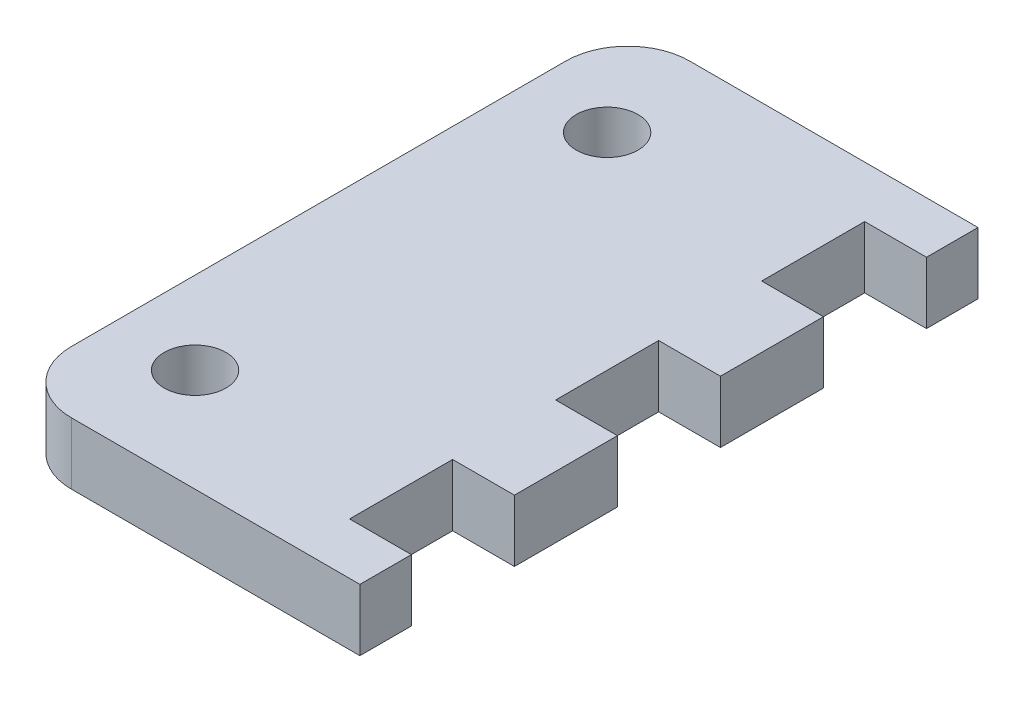
ISO-10303-21;
HEADER;
FILE_DESCRIPTION(('STEP AP214'),'2;1');
FILE_NAME('part.step','',(''),(''),'','','');
FILE_SCHEMA(('AUTOMOTIVE_DESIGN { 1 0 10303 214 1 1 1 1 }'));
ENDSEC;
DATA;
#1=APPLICATION_CONTEXT('core data for automotive mechanical design processes');
#2=APPLICATION_PROTOCOL_DEFINITION('international standard','automotive_design',2000,#1);
#3=PRODUCT_CONTEXT('',#1,'mechanical');
#4=PRODUCT('Part','Part','',(#3));
#5=PRODUCT_RELATED_PRODUCT_CATEGORY('part','',(#4));
#6=PRODUCT_DEFINITION_FORMATION('','',#4);
#7=PRODUCT_DEFINITION_CONTEXT('part definition',#1,'design');
#8=PRODUCT_DEFINITION('design','',#6,#7);
#9=PRODUCT_DEFINITION_SHAPE('','',#8);
#10=(LENGTH_UNIT() NAMED_UNIT(*) SI_UNIT(.MILLI.,.METRE.));
#11=(NAMED_UNIT(*) PLANE_ANGLE_UNIT() SI_UNIT($,.RADIAN.));
#12=(NAMED_UNIT(*) SI_UNIT($,.STERADIAN.) SOLID_ANGLE_UNIT());
#13=UNCERTAINTY_MEASURE_WITH_UNIT(LENGTH_MEASURE(1.E-05),#10,'distance_accuracy_value','');
#14=(GEOMETRIC_REPRESENTATION_CONTEXT(3) GLOBAL_UNCERTAINTY_ASSIGNED_CONTEXT((#13)) GLOBAL_UNIT_ASSIGNED_CONTEXT((#10,
#11,#12)) REPRESENTATION_CONTEXT('',''));
#15=CARTESIAN_POINT('',(0.,0.,0.));
#16=DIRECTION('',(0.,0.,1.));
#17=DIRECTION('',(1.,0.,0.));
#18=AXIS2_PLACEMENT_3D('',#15,#16,#17);
#19=CARTESIAN_POINT('',(8.5,3.,-15.));
#20=DIRECTION('',(-1.,0.,0.));
#21=DIRECTION('',(0.,0.,1.));
#22=AXIS2_PLACEMENT_3D('',#19,#20,#21);
#23=PLANE('',#22);
#24=DIRECTION('',(0.,0.,-1.));
#25=VECTOR('',#24,1.);
#26=CARTESIAN_POINT('',(8.5,0.,-15.));
#27=LINE('',#26,#25);
#28=CARTESIAN_POINT('',(8.5,0.,7.5));
#29=VERTEX_POINT('',#28);
#30=CARTESIAN_POINT('',(8.5,0.,2.5));
#31=VERTEX_POINT('',#30);
#32=EDGE_CURVE('E189',#29,#31,#27,.T.);
#33=ORIENTED_EDGE('',*,*,#32,.T.);
#34=DIRECTION('',(0.,1.,0.));
#35=VECTOR('',#34,1.);
#36=CARTESIAN_POINT('',(8.5,0.,2.5));
#37=LINE('',#36,#35);
#38=CARTESIAN_POINT('',(8.5,3.,2.5));
#39=VERTEX_POINT('',#38);
#40=EDGE_CURVE('E288',#31,#39,#37,.T.);
#41=ORIENTED_EDGE('',*,*,#40,.T.);
#42=DIRECTION('',(0.,0.,-1.));
#43=VECTOR('',#42,1.);
#44=CARTESIAN_POINT('',(8.5,3.,-15.));
#45=LINE('',#44,#43);
#46=CARTESIAN_POINT('',(8.5,3.,7.5));
#47=VERTEX_POINT('',#46);
#48=EDGE_CURVE('E302',#47,#39,#45,.T.);
#49=ORIENTED_EDGE('',*,*,#48,.F.);
#50=DIRECTION('',(0.,1.,0.));
#51=VECTOR('',#50,1.);
#52=CARTESIAN_POINT('',(8.5,0.,7.5));
#53=LINE('',#52,#51);
#54=EDGE_CURVE('E253',#29,#47,#53,.T.);
#55=ORIENTED_EDGE('',*,*,#54,.F.);
#56=EDGE_LOOP('',(#33,#41,#49,#55));
#57=FACE_BOUND('',#56,.T.);
#58=ADVANCED_FACE('F33',(#57),#23,.F.);
#59=CARTESIAN_POINT('',(8.5,0.,15.));
#60=VERTEX_POINT('',#59);
#61=CARTESIAN_POINT('',(8.5,0.,12.5));
#62=VERTEX_POINT('',#61);
#63=EDGE_CURVE('E192',#60,#62,#27,.T.);
#64=ORIENTED_EDGE('',*,*,#63,.T.);
#65=DIRECTION('',(0.,1.,0.));
#66=VECTOR('',#65,1.);
#67=CARTESIAN_POINT('',(8.5,0.,12.5));
#68=LINE('',#67,#66);
#69=CARTESIAN_POINT('',(8.5,3.,12.5));
#70=VERTEX_POINT('',#69);
#71=EDGE_CURVE('E270',#62,#70,#68,.T.);
#72=ORIENTED_EDGE('',*,*,#71,.T.);
#73=CARTESIAN_POINT('',(8.5,3.,15.));
#74=VERTEX_POINT('',#73);
#75=EDGE_CURVE('E299',#74,#70,#45,.T.);
#76=ORIENTED_EDGE('',*,*,#75,.F.);
#77=DIRECTION('',(0.,-1.,0.));
#78=VECTOR('',#77,1.);
#79=CARTESIAN_POINT('',(8.5,3.,15.));
#80=LINE('',#79,#78);
#81=EDGE_CURVE('E212',#74,#60,#80,.T.);
#82=ORIENTED_EDGE('',*,*,#81,.T.);
#83=EDGE_LOOP('',(#64,#72,#76,#82));
#84=FACE_BOUND('',#83,.T.);
#85=ADVANCED_FACE('F305',(#84),#23,.F.);
#86=CARTESIAN_POINT('',(8.5,3.,-2.5));
#87=VERTEX_POINT('',#86);
#88=CARTESIAN_POINT('',(8.5,3.,-7.5));
#89=VERTEX_POINT('',#88);
#90=EDGE_CURVE('E180',#87,#89,#45,.T.);
#91=ORIENTED_EDGE('',*,*,#90,.F.);
#92=DIRECTION('',(0.,1.,0.));
#93=VECTOR('',#92,1.);
#94=CARTESIAN_POINT('',(8.5,0.,-2.5));
#95=LINE('',#94,#93);
#96=CARTESIAN_POINT('',(8.5,0.,-2.5));
#97=VERTEX_POINT('',#96);
#98=EDGE_CURVE('E165',#97,#87,#95,.T.);
#99=ORIENTED_EDGE('',*,*,#98,.F.);
#100=CARTESIAN_POINT('',(8.5,0.,-7.5));
#101=VERTEX_POINT('',#100);
#102=EDGE_CURVE('E178',#97,#101,#27,.T.);
#103=ORIENTED_EDGE('',*,*,#102,.T.);
#104=DIRECTION('',(0.,1.,0.));
#105=VECTOR('',#104,1.);
#106=CARTESIAN_POINT('',(8.5,0.,-7.5));
#107=LINE('',#106,#105);
#108=EDGE_CURVE('E194',#101,#89,#107,.T.);
#109=ORIENTED_EDGE('',*,*,#108,.T.);
#110=EDGE_LOOP('',(#91,#99,#103,#109));
#111=FACE_BOUND('',#110,.T.);
#112=ADVANCED_FACE('F176',(#111),#23,.F.);
#113=CARTESIAN_POINT('',(8.5,3.,-12.5));
#114=VERTEX_POINT('',#113);
#115=CARTESIAN_POINT('',(8.5,3.,-15.));
#116=VERTEX_POINT('',#115);
#117=EDGE_CURVE('E211',#114,#116,#45,.T.);
#118=ORIENTED_EDGE('',*,*,#117,.F.);
#119=DIRECTION('',(0.,1.,0.));
#120=VECTOR('',#119,1.);
#121=CARTESIAN_POINT('',(8.5,0.,-12.5));
#122=LINE('',#121,#120);
#123=CARTESIAN_POINT('',(8.5,0.,-12.5));
#124=VERTEX_POINT('',#123);
#125=EDGE_CURVE('E283',#124,#114,#122,.T.);
#126=ORIENTED_EDGE('',*,*,#125,.F.);
#127=CARTESIAN_POINT('',(8.5,0.,-15.));
#128=VERTEX_POINT('',#127);
#129=EDGE_CURVE('E190',#124,#128,#27,.T.);
#130=ORIENTED_EDGE('',*,*,#129,.T.);
#131=DIRECTION('',(0.,-1.,0.));
#132=VECTOR('',#131,1.);
#133=CARTESIAN_POINT('',(8.5,3.,-15.));
#134=LINE('',#133,#132);
#135=EDGE_CURVE('E214',#116,#128,#134,.T.);
#136=ORIENTED_EDGE('',*,*,#135,.F.);
#137=EDGE_LOOP('',(#118,#126,#130,#136));
#138=FACE_BOUND('',#137,.T.);
#139=ADVANCED_FACE('F350',(#138),#23,.F.);
#140=CARTESIAN_POINT('',(-8.5,3.,-15.));
#141=DIRECTION('',(0.,0.,1.));
#142=DIRECTION('',(1.,0.,0.));
#143=AXIS2_PLACEMENT_3D('',#140,#141,#142);
#144=PLANE('',#143);
#145=DIRECTION('',(-1.,0.,0.));
#146=VECTOR('',#145,1.);
#147=CARTESIAN_POINT('',(-8.5,0.,-15.));
#148=LINE('',#147,#146);
#149=CARTESIAN_POINT('',(-5.5,0.,-15.));
#150=VERTEX_POINT('',#149);
#151=EDGE_CURVE('E198',#128,#150,#148,.T.);
#152=ORIENTED_EDGE('',*,*,#151,.T.);
#153=DIRECTION('',(0.,-1.,0.));
#154=VECTOR('',#153,1.);
#155=CARTESIAN_POINT('',(-5.5,3.,-15.));
#156=LINE('',#155,#154);
#157=CARTESIAN_POINT('',(-5.5,3.,-15.));
#158=VERTEX_POINT('',#157);
#159=EDGE_CURVE('E56',#150,#158,#156,.F.);
#160=ORIENTED_EDGE('',*,*,#159,.T.);
#161=DIRECTION('',(-1.,0.,0.));
#162=VECTOR('',#161,1.);
#163=CARTESIAN_POINT('',(-8.5,3.,-15.));
#164=LINE('',#163,#162);
#165=EDGE_CURVE('E231',#116,#158,#164,.T.);
#166=ORIENTED_EDGE('',*,*,#165,.F.);
#167=ORIENTED_EDGE('',*,*,#135,.T.);
#168=EDGE_LOOP('',(#152,#160,#166,#167));
#169=FACE_BOUND('',#168,.T.);
#170=ADVANCED_FACE('F356',(#169),#144,.F.);
#171=CARTESIAN_POINT('',(-8.5,3.,-15.));
#172=DIRECTION('',(1.,0.,0.));
#173=DIRECTION('',(0.,0.,-1.));
#174=AXIS2_PLACEMENT_3D('',#171,#172,#173);
#175=PLANE('',#174);
#176=DIRECTION('',(0.,0.,1.));
#177=VECTOR('',#176,1.);
#178=CARTESIAN_POINT('',(-8.5,3.,-15.));
#179=LINE('',#178,#177);
#180=CARTESIAN_POINT('',(-8.5,3.,-12.));
#181=VERTEX_POINT('',#180);
#182=CARTESIAN_POINT('',(-8.5,3.,12.));
#183=VERTEX_POINT('',#182);
#184=EDGE_CURVE('E230',#181,#183,#179,.T.);
#185=ORIENTED_EDGE('',*,*,#184,.F.);
#186=DIRECTION('',(0.,-1.,0.));
#187=VECTOR('',#186,1.);
#188=CARTESIAN_POINT('',(-8.5,3.,-12.));
#189=LINE('',#188,#187);
#190=CARTESIAN_POINT('',(-8.5,0.,-12.));
#191=VERTEX_POINT('',#190);
#192=EDGE_CURVE('E219',#181,#191,#189,.T.);
#193=ORIENTED_EDGE('',*,*,#192,.T.);
#194=DIRECTION('',(0.,0.,1.));
#195=VECTOR('',#194,1.);
#196=CARTESIAN_POINT('',(-8.5,0.,-15.));
#197=LINE('',#196,#195);
#198=CARTESIAN_POINT('',(-8.5,0.,12.));
#199=VERTEX_POINT('',#198);
#200=EDGE_CURVE('E203',#191,#199,#197,.T.);
#201=ORIENTED_EDGE('',*,*,#200,.T.);
#202=DIRECTION('',(0.,-1.,0.));
#203=VECTOR('',#202,1.);
#204=CARTESIAN_POINT('',(-8.5,3.,12.));
#205=LINE('',#204,#203);
#206=EDGE_CURVE('E217',#199,#183,#205,.F.);
#207=ORIENTED_EDGE('',*,*,#206,.T.);
#208=EDGE_LOOP('',(#185,#193,#201,#207));
#209=FACE_BOUND('',#208,.T.);
#210=ADVANCED_FACE('F235',(#209),#175,.F.);
#211=CARTESIAN_POINT('',(-8.5,3.,15.));
#212=DIRECTION('',(0.,0.,-1.));
#213=DIRECTION('',(-1.,0.,0.));
#214=AXIS2_PLACEMENT_3D('',#211,#212,#213);
#215=PLANE('',#214);
#216=DIRECTION('',(1.,0.,0.));
#217=VECTOR('',#216,1.);
#218=CARTESIAN_POINT('',(-8.5,3.,15.));
#219=LINE('',#218,#217);
#220=CARTESIAN_POINT('',(-5.5,3.,15.));
#221=VERTEX_POINT('',#220);
#222=EDGE_CURVE('E215',#221,#74,#219,.T.);
#223=ORIENTED_EDGE('',*,*,#222,.F.);
#224=DIRECTION('',(0.,-1.,0.));
#225=VECTOR('',#224,1.);
#226=CARTESIAN_POINT('',(-5.5,3.,15.));
#227=LINE('',#226,#225);
#228=CARTESIAN_POINT('',(-5.5,0.,15.));
#229=VERTEX_POINT('',#228);
#230=EDGE_CURVE('E11',#221,#229,#227,.T.);
#231=ORIENTED_EDGE('',*,*,#230,.T.);
#232=DIRECTION('',(1.,0.,0.));
#233=VECTOR('',#232,1.);
#234=CARTESIAN_POINT('',(-8.5,0.,15.));
#235=LINE('',#234,#233);
#236=EDGE_CURVE('E207',#229,#60,#235,.T.);
#237=ORIENTED_EDGE('',*,*,#236,.T.);
#238=ORIENTED_EDGE('',*,*,#81,.F.);
#239=EDGE_LOOP('',(#223,#231,#237,#238));
#240=FACE_BOUND('',#239,.T.);
#241=ADVANCED_FACE('F244',(#240),#215,.F.);
#242=CARTESIAN_POINT('',(0.,3.,0.));
#243=DIRECTION('',(0.,1.,0.));
#244=DIRECTION('',(0.,0.,1.));
#245=AXIS2_PLACEMENT_3D('',#242,#243,#244);
#246=PLANE('',#245);
#247=CARTESIAN_POINT('',(-4.5,3.,10.));
#248=DIRECTION('',(0.,1.,0.));
#249=DIRECTION('',(0.,0.,1.));
#250=AXIS2_PLACEMENT_3D('',#247,#248,#249);
#251=CIRCLE('',#250,1.5);
#252=CARTESIAN_POINT('',(-4.5,3.,11.5));
#253=VERTEX_POINT('',#252);
#254=EDGE_CURVE('E538',#253,#253,#251,.T.);
#255=ORIENTED_EDGE('',*,*,#254,.F.);
#256=EDGE_LOOP('',(#255));
#257=FACE_BOUND('',#256,.T.);
#258=CARTESIAN_POINT('',(-4.5,3.,-10.));
#259=DIRECTION('',(0.,1.,0.));
#260=DIRECTION('',(0.,0.,1.));
#261=AXIS2_PLACEMENT_3D('',#258,#259,#260);
#262=CIRCLE('',#261,1.5);
#263=CARTESIAN_POINT('',(-4.5,3.,-8.5));
#264=VERTEX_POINT('',#263);
#265=EDGE_CURVE('E540',#264,#264,#262,.T.);
#266=ORIENTED_EDGE('',*,*,#265,.F.);
#267=EDGE_LOOP('',(#266));
#268=FACE_BOUND('',#267,.T.);
#269=ORIENTED_EDGE('',*,*,#165,.T.);
#270=CARTESIAN_POINT('',(-5.5,3.,-12.));
#271=DIRECTION('',(0.,1.,0.));
#272=DIRECTION('',(0.,0.,1.));
#273=AXIS2_PLACEMENT_3D('',#270,#271,#272);
#274=CIRCLE('',#273,3.);
#275=EDGE_CURVE('E41',#158,#181,#274,.T.);
#276=ORIENTED_EDGE('',*,*,#275,.T.);
#277=ORIENTED_EDGE('',*,*,#184,.T.);
#278=CARTESIAN_POINT('',(-5.5,3.,12.));
#279=DIRECTION('',(0.,1.,0.));
#280=DIRECTION('',(0.,0.,1.));
#281=AXIS2_PLACEMENT_3D('',#278,#279,#280);
#282=CIRCLE('',#281,3.);
#283=EDGE_CURVE('E48',#183,#221,#282,.T.);
#284=ORIENTED_EDGE('',*,*,#283,.T.);
#285=ORIENTED_EDGE('',*,*,#222,.T.);
#286=ORIENTED_EDGE('',*,*,#75,.T.);
#287=DIRECTION('',(1.,0.,0.));
#288=VECTOR('',#287,1.);
#289=CARTESIAN_POINT('',(8.5,3.,12.5));
#290=LINE('',#289,#288);
#291=CARTESIAN_POINT('',(5.50000000000001,3.,12.5));
#292=VERTEX_POINT('',#291);
#293=EDGE_CURVE('E268',#292,#70,#290,.T.);
#294=ORIENTED_EDGE('',*,*,#293,.F.);
#295=DIRECTION('',(0.,0.,1.));
#296=VECTOR('',#295,1.);
#297=CARTESIAN_POINT('',(5.5,3.,7.5));
#298=LINE('',#297,#296);
#299=CARTESIAN_POINT('',(5.5,3.,7.5));
#300=VERTEX_POINT('',#299);
#301=EDGE_CURVE('E264',#300,#292,#298,.T.);
#302=ORIENTED_EDGE('',*,*,#301,.F.);
#303=DIRECTION('',(-1.,0.,0.));
#304=VECTOR('',#303,1.);
#305=CARTESIAN_POINT('',(8.5,3.,7.5));
#306=LINE('',#305,#304);
#307=EDGE_CURVE('E261',#47,#300,#306,.T.);
#308=ORIENTED_EDGE('',*,*,#307,.F.);
#309=ORIENTED_EDGE('',*,*,#48,.T.);
#310=DIRECTION('',(1.,0.,0.));
#311=VECTOR('',#310,1.);
#312=CARTESIAN_POINT('',(8.5,3.,2.5));
#313=LINE('',#312,#311);
#314=CARTESIAN_POINT('',(5.50000000000001,3.,2.5));
#315=VERTEX_POINT('',#314);
#316=EDGE_CURVE('E172',#315,#39,#313,.T.);
#317=ORIENTED_EDGE('',*,*,#316,.F.);
#318=DIRECTION('',(0.,0.,1.));
#319=VECTOR('',#318,1.);
#320=CARTESIAN_POINT('',(5.5,3.,-2.5));
#321=LINE('',#320,#319);
#322=CARTESIAN_POINT('',(5.5,3.,-2.5));
#323=VERTEX_POINT('',#322);
#324=EDGE_CURVE('E327',#323,#315,#321,.T.);
#325=ORIENTED_EDGE('',*,*,#324,.F.);
#326=DIRECTION('',(-1.,0.,0.));
#327=VECTOR('',#326,1.);
#328=CARTESIAN_POINT('',(8.5,3.,-2.5));
#329=LINE('',#328,#327);
#330=EDGE_CURVE('E272',#87,#323,#329,.T.);
#331=ORIENTED_EDGE('',*,*,#330,.F.);
#332=ORIENTED_EDGE('',*,*,#90,.T.);
#333=DIRECTION('',(1.,0.,0.));
#334=VECTOR('',#333,1.);
#335=CARTESIAN_POINT('',(5.5,3.,-7.5));
#336=LINE('',#335,#334);
#337=CARTESIAN_POINT('',(5.5,3.,-7.5));
#338=VERTEX_POINT('',#337);
#339=EDGE_CURVE('E280',#338,#89,#336,.T.);
#340=ORIENTED_EDGE('',*,*,#339,.F.);
#341=DIRECTION('',(0.,0.,1.));
#342=VECTOR('',#341,1.);
#343=CARTESIAN_POINT('',(5.5,3.,-12.5));
#344=LINE('',#343,#342);
#345=CARTESIAN_POINT('',(5.5,3.,-12.5));
#346=VERTEX_POINT('',#345);
#347=EDGE_CURVE('E287',#346,#338,#344,.T.);
#348=ORIENTED_EDGE('',*,*,#347,.F.);
#349=DIRECTION('',(-1.,0.,0.));
#350=VECTOR('',#349,1.);
#351=CARTESIAN_POINT('',(8.5,3.,-12.5));
#352=LINE('',#351,#350);
#353=EDGE_CURVE('E284',#114,#346,#352,.T.);
#354=ORIENTED_EDGE('',*,*,#353,.F.);
#355=ORIENTED_EDGE('',*,*,#117,.T.);
#356=EDGE_LOOP('',(#269,#276,#277,#284,#285,#286,#294,#302,#308,#309,#317,#325,#331,#332,#340,
#348,#354,#355));
#357=FACE_BOUND('',#356,.T.);
#358=ADVANCED_FACE('F229',(#257,#268,#357),#246,.T.);
#359=CARTESIAN_POINT('',(0.,0.,0.));
#360=DIRECTION('',(0.,1.,0.));
#361=DIRECTION('',(0.,0.,1.));
#362=AXIS2_PLACEMENT_3D('',#359,#360,#361);
#363=PLANE('',#362);
#364=CARTESIAN_POINT('',(-4.5,0.,10.));
#365=DIRECTION('',(0.,1.,0.));
#366=DIRECTION('',(0.,0.,1.));
#367=AXIS2_PLACEMENT_3D('',#364,#365,#366);
#368=CIRCLE('',#367,1.5);
#369=CARTESIAN_POINT('',(-4.5,0.,11.5));
#370=VERTEX_POINT('',#369);
#371=EDGE_CURVE('E535',#370,#370,#368,.T.);
#372=ORIENTED_EDGE('',*,*,#371,.T.);
#373=EDGE_LOOP('',(#372));
#374=FACE_BOUND('',#373,.T.);
#375=CARTESIAN_POINT('',(-4.5,0.,-10.));
#376=DIRECTION('',(0.,1.,0.));
#377=DIRECTION('',(0.,0.,1.));
#378=AXIS2_PLACEMENT_3D('',#375,#376,#377);
#379=CIRCLE('',#378,1.5);
#380=CARTESIAN_POINT('',(-4.5,0.,-8.5));
#381=VERTEX_POINT('',#380);
#382=EDGE_CURVE('E265',#381,#381,#379,.T.);
#383=ORIENTED_EDGE('',*,*,#382,.T.);
#384=EDGE_LOOP('',(#383));
#385=FACE_BOUND('',#384,.T.);
#386=ORIENTED_EDGE('',*,*,#200,.F.);
#387=CARTESIAN_POINT('',(-5.5,0.,-12.));
#388=DIRECTION('',(0.,1.,0.));
#389=DIRECTION('',(0.,0.,1.));
#390=AXIS2_PLACEMENT_3D('',#387,#388,#389);
#391=CIRCLE('',#390,3.);
#392=EDGE_CURVE('E224',#191,#150,#391,.F.);
#393=ORIENTED_EDGE('',*,*,#392,.T.);
#394=ORIENTED_EDGE('',*,*,#151,.F.);
#395=ORIENTED_EDGE('',*,*,#129,.F.);
#396=DIRECTION('',(-1.,0.,0.));
#397=VECTOR('',#396,1.);
#398=CARTESIAN_POINT('',(8.5,0.,-12.5));
#399=LINE('',#398,#397);
#400=CARTESIAN_POINT('',(5.5,0.,-12.5));
#401=VERTEX_POINT('',#400);
#402=EDGE_CURVE('E276',#124,#401,#399,.T.);
#403=ORIENTED_EDGE('',*,*,#402,.T.);
#404=DIRECTION('',(0.,0.,1.));
#405=VECTOR('',#404,1.);
#406=CARTESIAN_POINT('',(5.5,0.,-12.5));
#407=LINE('',#406,#405);
#408=CARTESIAN_POINT('',(5.5,0.,-7.5));
#409=VERTEX_POINT('',#408);
#410=EDGE_CURVE('E279',#401,#409,#407,.T.);
#411=ORIENTED_EDGE('',*,*,#410,.T.);
#412=DIRECTION('',(1.,0.,0.));
#413=VECTOR('',#412,1.);
#414=CARTESIAN_POINT('',(5.5,0.,-7.5));
#415=LINE('',#414,#413);
#416=EDGE_CURVE('E188',#409,#101,#415,.T.);
#417=ORIENTED_EDGE('',*,*,#416,.T.);
#418=ORIENTED_EDGE('',*,*,#102,.F.);
#419=DIRECTION('',(-1.,0.,0.));
#420=VECTOR('',#419,1.);
#421=CARTESIAN_POINT('',(8.5,0.,-2.5));
#422=LINE('',#421,#420);
#423=CARTESIAN_POINT('',(5.5,0.,-2.5));
#424=VERTEX_POINT('',#423);
#425=EDGE_CURVE('E161',#97,#424,#422,.T.);
#426=ORIENTED_EDGE('',*,*,#425,.T.);
#427=DIRECTION('',(0.,0.,1.));
#428=VECTOR('',#427,1.);
#429=CARTESIAN_POINT('',(5.5,0.,-2.5));
#430=LINE('',#429,#428);
#431=CARTESIAN_POINT('',(5.50000000000001,0.,2.5));
#432=VERTEX_POINT('',#431);
#433=EDGE_CURVE('E171',#424,#432,#430,.T.);
#434=ORIENTED_EDGE('',*,*,#433,.T.);
#435=DIRECTION('',(1.,0.,0.));
#436=VECTOR('',#435,1.);
#437=CARTESIAN_POINT('',(8.5,0.,2.5));
#438=LINE('',#437,#436);
#439=EDGE_CURVE('E181',#432,#31,#438,.T.);
#440=ORIENTED_EDGE('',*,*,#439,.T.);
#441=ORIENTED_EDGE('',*,*,#32,.F.);
#442=DIRECTION('',(-1.,0.,0.));
#443=VECTOR('',#442,1.);
#444=CARTESIAN_POINT('',(8.5,0.,7.5));
#445=LINE('',#444,#443);
#446=CARTESIAN_POINT('',(5.5,0.,7.5));
#447=VERTEX_POINT('',#446);
#448=EDGE_CURVE('E257',#29,#447,#445,.T.);
#449=ORIENTED_EDGE('',*,*,#448,.T.);
#450=DIRECTION('',(0.,0.,1.));
#451=VECTOR('',#450,1.);
#452=CARTESIAN_POINT('',(5.5,0.,7.5));
#453=LINE('',#452,#451);
#454=CARTESIAN_POINT('',(5.50000000000001,0.,12.5));
#455=VERTEX_POINT('',#454);
#456=EDGE_CURVE('E251',#447,#455,#453,.T.);
#457=ORIENTED_EDGE('',*,*,#456,.T.);
#458=DIRECTION('',(1.,0.,0.));
#459=VECTOR('',#458,1.);
#460=CARTESIAN_POINT('',(8.5,0.,12.5));
#461=LINE('',#460,#459);
#462=EDGE_CURVE('E249',#455,#62,#461,.T.);
#463=ORIENTED_EDGE('',*,*,#462,.T.);
#464=ORIENTED_EDGE('',*,*,#63,.F.);
#465=ORIENTED_EDGE('',*,*,#236,.F.);
#466=CARTESIAN_POINT('',(-5.5,0.,12.));
#467=DIRECTION('',(0.,1.,0.));
#468=DIRECTION('',(0.,0.,1.));
#469=AXIS2_PLACEMENT_3D('',#466,#467,#468);
#470=CIRCLE('',#469,3.);
#471=EDGE_CURVE('E222',#229,#199,#470,.F.);
#472=ORIENTED_EDGE('',*,*,#471,.T.);
#473=EDGE_LOOP('',(#386,#393,#394,#395,#403,#411,#417,#418,#426,#434,#440,#441,#449,#457,#463,
#464,#465,#472));
#474=FACE_BOUND('',#473,.T.);
#475=ADVANCED_FACE('F185',(#374,#385,#474),#363,.F.);
#476=CARTESIAN_POINT('',(5.5,0.,-7.5));
#477=DIRECTION('',(0.,0.,1.));
#478=DIRECTION('',(1.,0.,0.));
#479=AXIS2_PLACEMENT_3D('',#476,#477,#478);
#480=PLANE('',#479);
#481=ORIENTED_EDGE('',*,*,#339,.T.);
#482=ORIENTED_EDGE('',*,*,#108,.F.);
#483=ORIENTED_EDGE('',*,*,#416,.F.);
#484=DIRECTION('',(0.,1.,0.));
#485=VECTOR('',#484,1.);
#486=CARTESIAN_POINT('',(5.5,0.,-7.5));
#487=LINE('',#486,#485);
#488=EDGE_CURVE('E294',#409,#338,#487,.T.);
#489=ORIENTED_EDGE('',*,*,#488,.T.);
#490=EDGE_LOOP('',(#481,#482,#483,#489));
#491=FACE_BOUND('',#490,.T.);
#492=ADVANCED_FACE('F369',(#491),#480,.F.);
#493=CARTESIAN_POINT('',(5.5,0.,-12.5));
#494=DIRECTION('',(-1.,0.,0.));
#495=DIRECTION('',(0.,0.,1.));
#496=AXIS2_PLACEMENT_3D('',#493,#494,#495);
#497=PLANE('',#496);
#498=ORIENTED_EDGE('',*,*,#347,.T.);
#499=ORIENTED_EDGE('',*,*,#488,.F.);
#500=ORIENTED_EDGE('',*,*,#410,.F.);
#501=DIRECTION('',(0.,1.,0.));
#502=VECTOR('',#501,1.);
#503=CARTESIAN_POINT('',(5.5,0.,-12.5));
#504=LINE('',#503,#502);
#505=EDGE_CURVE('E296',#401,#346,#504,.T.);
#506=ORIENTED_EDGE('',*,*,#505,.T.);
#507=EDGE_LOOP('',(#498,#499,#500,#506));
#508=FACE_BOUND('',#507,.T.);
#509=ADVANCED_FACE('F371',(#508),#497,.F.);
#510=CARTESIAN_POINT('',(8.5,0.,-12.5));
#511=DIRECTION('',(0.,0.,-1.));
#512=DIRECTION('',(-1.,0.,0.));
#513=AXIS2_PLACEMENT_3D('',#510,#511,#512);
#514=PLANE('',#513);
#515=ORIENTED_EDGE('',*,*,#353,.T.);
#516=ORIENTED_EDGE('',*,*,#505,.F.);
#517=ORIENTED_EDGE('',*,*,#402,.F.);
#518=ORIENTED_EDGE('',*,*,#125,.T.);
#519=EDGE_LOOP('',(#515,#516,#517,#518));
#520=FACE_BOUND('',#519,.T.);
#521=ADVANCED_FACE('F374',(#520),#514,.F.);
#522=CARTESIAN_POINT('',(8.5,0.,12.5));
#523=DIRECTION('',(0.,0.,1.));
#524=DIRECTION('',(1.,0.,0.));
#525=AXIS2_PLACEMENT_3D('',#522,#523,#524);
#526=PLANE('',#525);
#527=ORIENTED_EDGE('',*,*,#293,.T.);
#528=ORIENTED_EDGE('',*,*,#71,.F.);
#529=ORIENTED_EDGE('',*,*,#462,.F.);
#530=DIRECTION('',(0.,1.,0.));
#531=VECTOR('',#530,1.);
#532=CARTESIAN_POINT('',(5.50000000000001,0.,12.5));
#533=LINE('',#532,#531);
#534=EDGE_CURVE('E273',#455,#292,#533,.T.);
#535=ORIENTED_EDGE('',*,*,#534,.T.);
#536=EDGE_LOOP('',(#527,#528,#529,#535));
#537=FACE_BOUND('',#536,.T.);
#538=ADVANCED_FACE('F306',(#537),#526,.F.);
#539=CARTESIAN_POINT('',(5.5,0.,7.5));
#540=DIRECTION('',(-1.,0.,0.));
#541=DIRECTION('',(0.,0.,1.));
#542=AXIS2_PLACEMENT_3D('',#539,#540,#541);
#543=PLANE('',#542);
#544=ORIENTED_EDGE('',*,*,#301,.T.);
#545=ORIENTED_EDGE('',*,*,#534,.F.);
#546=ORIENTED_EDGE('',*,*,#456,.F.);
#547=DIRECTION('',(0.,1.,0.));
#548=VECTOR('',#547,1.);
#549=CARTESIAN_POINT('',(5.5,0.,7.5));
#550=LINE('',#549,#548);
#551=EDGE_CURVE('E255',#447,#300,#550,.T.);
#552=ORIENTED_EDGE('',*,*,#551,.T.);
#553=EDGE_LOOP('',(#544,#545,#546,#552));
#554=FACE_BOUND('',#553,.T.);
#555=ADVANCED_FACE('F312',(#554),#543,.F.);
#556=CARTESIAN_POINT('',(8.5,0.,7.5));
#557=DIRECTION('',(0.,0.,-1.));
#558=DIRECTION('',(-1.,0.,0.));
#559=AXIS2_PLACEMENT_3D('',#556,#557,#558);
#560=PLANE('',#559);
#561=ORIENTED_EDGE('',*,*,#307,.T.);
#562=ORIENTED_EDGE('',*,*,#551,.F.);
#563=ORIENTED_EDGE('',*,*,#448,.F.);
#564=ORIENTED_EDGE('',*,*,#54,.T.);
#565=EDGE_LOOP('',(#561,#562,#563,#564));
#566=FACE_BOUND('',#565,.T.);
#567=ADVANCED_FACE('F315',(#566),#560,.F.);
#568=CARTESIAN_POINT('',(8.5,0.,2.5));
#569=DIRECTION('',(0.,0.,1.));
#570=DIRECTION('',(1.,0.,0.));
#571=AXIS2_PLACEMENT_3D('',#568,#569,#570);
#572=PLANE('',#571);
#573=ORIENTED_EDGE('',*,*,#316,.T.);
#574=ORIENTED_EDGE('',*,*,#40,.F.);
#575=ORIENTED_EDGE('',*,*,#439,.F.);
#576=DIRECTION('',(0.,1.,0.));
#577=VECTOR('',#576,1.);
#578=CARTESIAN_POINT('',(5.50000000000001,0.,2.5));
#579=LINE('',#578,#577);
#580=EDGE_CURVE('E332',#432,#315,#579,.T.);
#581=ORIENTED_EDGE('',*,*,#580,.T.);
#582=EDGE_LOOP('',(#573,#574,#575,#581));
#583=FACE_BOUND('',#582,.T.);
#584=ADVANCED_FACE('F338',(#583),#572,.F.);
#585=CARTESIAN_POINT('',(5.5,0.,-2.5));
#586=DIRECTION('',(-1.,0.,0.));
#587=DIRECTION('',(0.,0.,1.));
#588=AXIS2_PLACEMENT_3D('',#585,#586,#587);
#589=PLANE('',#588);
#590=ORIENTED_EDGE('',*,*,#324,.T.);
#591=ORIENTED_EDGE('',*,*,#580,.F.);
#592=ORIENTED_EDGE('',*,*,#433,.F.);
#593=DIRECTION('',(0.,1.,0.));
#594=VECTOR('',#593,1.);
#595=CARTESIAN_POINT('',(5.5,0.,-2.5));
#596=LINE('',#595,#594);
#597=EDGE_CURVE('E167',#424,#323,#596,.T.);
#598=ORIENTED_EDGE('',*,*,#597,.T.);
#599=EDGE_LOOP('',(#590,#591,#592,#598));
#600=FACE_BOUND('',#599,.T.);
#601=ADVANCED_FACE('F335',(#600),#589,.F.);
#602=CARTESIAN_POINT('',(8.5,0.,-2.5));
#603=DIRECTION('',(0.,0.,-1.));
#604=DIRECTION('',(-1.,0.,0.));
#605=AXIS2_PLACEMENT_3D('',#602,#603,#604);
#606=PLANE('',#605);
#607=ORIENTED_EDGE('',*,*,#330,.T.);
#608=ORIENTED_EDGE('',*,*,#597,.F.);
#609=ORIENTED_EDGE('',*,*,#425,.F.);
#610=ORIENTED_EDGE('',*,*,#98,.T.);
#611=EDGE_LOOP('',(#607,#608,#609,#610));
#612=FACE_BOUND('',#611,.T.);
#613=ADVANCED_FACE('F164',(#612),#606,.F.);
#614=CARTESIAN_POINT('',(-4.5,0.,-10.));
#615=DIRECTION('',(0.,1.,0.));
#616=DIRECTION('',(0.,0.,1.));
#617=AXIS2_PLACEMENT_3D('',#614,#615,#616);
#618=CYLINDRICAL_SURFACE('',#617,1.5);
#619=ORIENTED_EDGE('',*,*,#382,.F.);
#620=EDGE_LOOP('',(#619));
#621=FACE_BOUND('',#620,.T.);
#622=ORIENTED_EDGE('',*,*,#265,.T.);
#623=EDGE_LOOP('',(#622));
#624=FACE_BOUND('',#623,.T.);
#625=ADVANCED_FACE('F463',(#621,#624),#618,.F.);
#626=CARTESIAN_POINT('',(-4.5,0.,10.));
#627=DIRECTION('',(0.,1.,0.));
#628=DIRECTION('',(0.,0.,1.));
#629=AXIS2_PLACEMENT_3D('',#626,#627,#628);
#630=CYLINDRICAL_SURFACE('',#629,1.5);
#631=ORIENTED_EDGE('',*,*,#371,.F.);
#632=EDGE_LOOP('',(#631));
#633=FACE_BOUND('',#632,.T.);
#634=ORIENTED_EDGE('',*,*,#254,.T.);
#635=EDGE_LOOP('',(#634));
#636=FACE_BOUND('',#635,.T.);
#637=ADVANCED_FACE('F472',(#633,#636),#630,.F.);
#638=CARTESIAN_POINT('',(-5.5,3.,-12.));
#639=DIRECTION('',(0.,-1.,0.));
#640=DIRECTION('',(0.,0.,-1.));
#641=AXIS2_PLACEMENT_3D('',#638,#639,#640);
#642=CYLINDRICAL_SURFACE('',#641,3.);
#643=ORIENTED_EDGE('',*,*,#275,.F.);
#644=ORIENTED_EDGE('',*,*,#159,.F.);
#645=ORIENTED_EDGE('',*,*,#392,.F.);
#646=ORIENTED_EDGE('',*,*,#192,.F.);
#647=EDGE_LOOP('',(#643,#644,#645,#646));
#648=FACE_BOUND('',#647,.T.);
#649=ADVANCED_FACE('F238',(#648),#642,.T.);
#650=CARTESIAN_POINT('',(-5.5,3.,12.));
#651=DIRECTION('',(0.,-1.,0.));
#652=DIRECTION('',(0.,0.,-1.));
#653=AXIS2_PLACEMENT_3D('',#650,#651,#652);
#654=CYLINDRICAL_SURFACE('',#653,3.);
#655=ORIENTED_EDGE('',*,*,#283,.F.);
#656=ORIENTED_EDGE('',*,*,#206,.F.);
#657=ORIENTED_EDGE('',*,*,#471,.F.);
#658=ORIENTED_EDGE('',*,*,#230,.F.);
#659=EDGE_LOOP('',(#655,#656,#657,#658));
#660=FACE_BOUND('',#659,.T.);
#661=ADVANCED_FACE('F35',(#660),#654,.T.);
#662=CLOSED_SHELL('',(#58,#85,#112,#139,#170,#210,#241,#358,#475,#492,#509,#521,#538,#555,#567,
#584,#601,#613,#625,#637,#649,#661));
#663=MANIFOLD_SOLID_BREP('B2',#662);
#664=ADVANCED_BREP_SHAPE_REPRESENTATION('',(#18,#663),#14);
#665=SHAPE_DEFINITION_REPRESENTATION(#9,#664);
ENDSEC;
END-ISO-10303-21;
